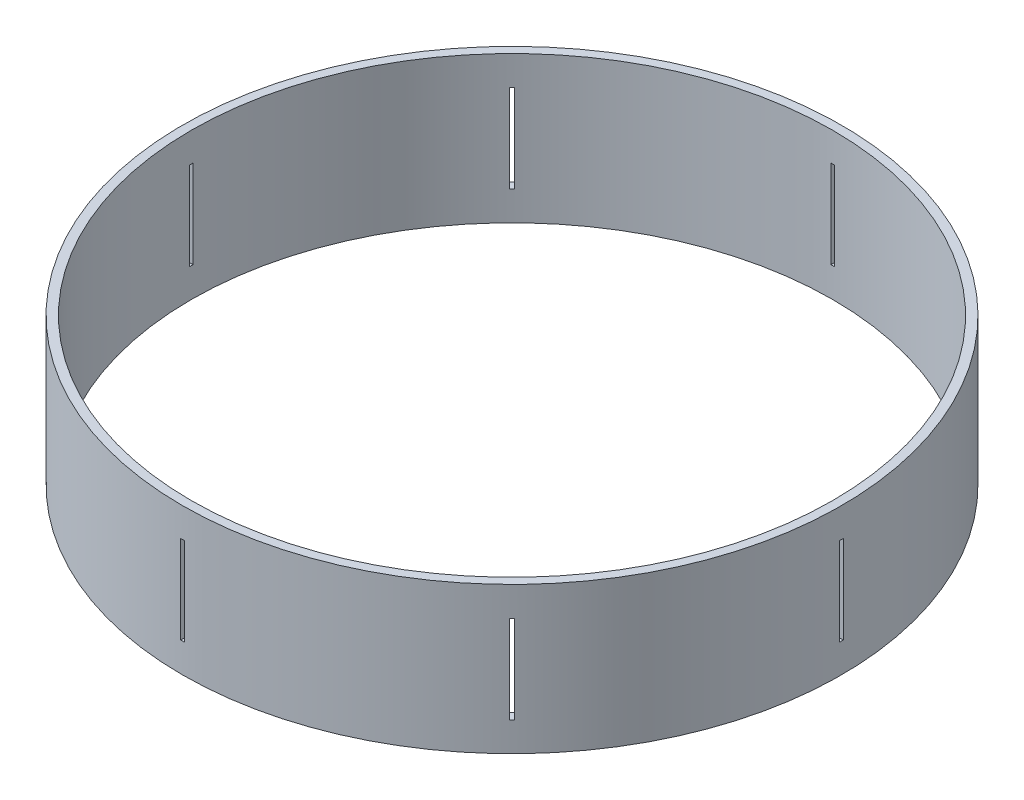
ISO-10303-21;
HEADER;
FILE_DESCRIPTION(('STEP AP214'),'2;1');
FILE_NAME('part.step','',(''),(''),'','','');
FILE_SCHEMA(('AUTOMOTIVE_DESIGN { 1 0 10303 214 1 1 1 1 }'));
ENDSEC;
DATA;
#1=APPLICATION_CONTEXT('core data for automotive mechanical design processes');
#2=APPLICATION_PROTOCOL_DEFINITION('international standard','automotive_design',2000,#1);
#3=PRODUCT_CONTEXT('',#1,'mechanical');
#4=PRODUCT('Part','Part','',(#3));
#5=PRODUCT_RELATED_PRODUCT_CATEGORY('part','',(#4));
#6=PRODUCT_DEFINITION_FORMATION('','',#4);
#7=PRODUCT_DEFINITION_CONTEXT('part definition',#1,'design');
#8=PRODUCT_DEFINITION('design','',#6,#7);
#9=PRODUCT_DEFINITION_SHAPE('','',#8);
#10=(LENGTH_UNIT() NAMED_UNIT(*) SI_UNIT(.MILLI.,.METRE.));
#11=(NAMED_UNIT(*) PLANE_ANGLE_UNIT() SI_UNIT($,.RADIAN.));
#12=(NAMED_UNIT(*) SI_UNIT($,.STERADIAN.) SOLID_ANGLE_UNIT());
#13=UNCERTAINTY_MEASURE_WITH_UNIT(LENGTH_MEASURE(1.E-05),#10,'distance_accuracy_value','');
#14=(GEOMETRIC_REPRESENTATION_CONTEXT(3) GLOBAL_UNCERTAINTY_ASSIGNED_CONTEXT((#13)) GLOBAL_UNIT_ASSIGNED_CONTEXT((#10,
#11,#12)) REPRESENTATION_CONTEXT('',''));
#15=CARTESIAN_POINT('',(0.,0.,0.));
#16=DIRECTION('',(0.,0.,1.));
#17=DIRECTION('',(1.,0.,0.));
#18=AXIS2_PLACEMENT_3D('',#15,#16,#17);
#19=CARTESIAN_POINT('',(138.90625,192.951652173913,0.));
#20=DIRECTION('',(0.,1.,0.));
#21=DIRECTION('',(0.,0.,1.));
#22=AXIS2_PLACEMENT_3D('',#19,#20,#21);
#23=PLANE('',#22);
#24=CARTESIAN_POINT('',(0.,192.951652173913,0.));
#25=DIRECTION('',(0.,1.,0.));
#26=DIRECTION('',(0.,0.,1.));
#27=AXIS2_PLACEMENT_3D('',#24,#25,#26);
#28=CIRCLE('',#27,142.71625);
#29=CARTESIAN_POINT('',(0.,192.951652173913,142.71625));
#30=VERTEX_POINT('',#29);
#31=EDGE_CURVE('E476',#30,#30,#28,.T.);
#32=ORIENTED_EDGE('',*,*,#31,.T.);
#33=EDGE_LOOP('',(#32));
#34=FACE_BOUND('',#33,.T.);
#35=CARTESIAN_POINT('',(0.,192.951652173913,0.));
#36=DIRECTION('',(0.,1.,0.));
#37=DIRECTION('',(0.,0.,1.));
#38=AXIS2_PLACEMENT_3D('',#35,#36,#37);
#39=CIRCLE('',#38,138.90625);
#40=CARTESIAN_POINT('',(0.,192.951652173913,138.90625));
#41=VERTEX_POINT('',#40);
#42=EDGE_CURVE('E464',#41,#41,#39,.T.);
#43=ORIENTED_EDGE('',*,*,#42,.F.);
#44=EDGE_LOOP('',(#43));
#45=FACE_BOUND('',#44,.T.);
#46=ADVANCED_FACE('F41',(#34,#45),#23,.T.);
#47=CARTESIAN_POINT('',(0.,0.,0.));
#48=DIRECTION('',(0.,1.,0.));
#49=DIRECTION('',(0.,0.,1.));
#50=AXIS2_PLACEMENT_3D('',#47,#48,#49);
#51=CYLINDRICAL_SURFACE('',#50,142.71625);
#52=DIRECTION('',(0.,1.,0.));
#53=VECTOR('',#52,1.);
#54=CARTESIAN_POINT('',(100.375374343753,0.,101.453005078282));
#55=LINE('',#54,#53);
#56=CARTESIAN_POINT('',(100.375374343753,180.251652173913,101.453005078282));
#57=VERTEX_POINT('',#56);
#58=CARTESIAN_POINT('',(100.375374343753,142.151652173913,101.453005078282));
#59=VERTEX_POINT('',#58);
#60=EDGE_CURVE('E375',#57,#59,#55,.F.);
#61=ORIENTED_EDGE('',*,*,#60,.F.);
#62=CARTESIAN_POINT('',(0.,180.251652173913,0.));
#63=DIRECTION('',(0.,-1.,0.));
#64=DIRECTION('',(0.,0.,-1.));
#65=AXIS2_PLACEMENT_3D('',#62,#63,#64);
#66=CIRCLE('',#65,142.71625);
#67=CARTESIAN_POINT('',(101.453005078282,180.251652173913,100.375374343754));
#68=VERTEX_POINT('',#67);
#69=EDGE_CURVE('E367',#68,#57,#66,.T.);
#70=ORIENTED_EDGE('',*,*,#69,.F.);
#71=DIRECTION('',(0.,1.,0.));
#72=VECTOR('',#71,1.);
#73=CARTESIAN_POINT('',(101.453005078282,0.,100.375374343754));
#74=LINE('',#73,#72);
#75=CARTESIAN_POINT('',(101.453005078282,142.151652173913,100.375374343754));
#76=VERTEX_POINT('',#75);
#77=EDGE_CURVE('E56',#76,#68,#74,.T.);
#78=ORIENTED_EDGE('',*,*,#77,.F.);
#79=CARTESIAN_POINT('',(0.,142.151652173913,0.));
#80=DIRECTION('',(0.,1.,0.));
#81=DIRECTION('',(0.,0.,1.));
#82=AXIS2_PLACEMENT_3D('',#79,#80,#81);
#83=CIRCLE('',#82,142.71625);
#84=EDGE_CURVE('E371',#59,#76,#83,.T.);
#85=ORIENTED_EDGE('',*,*,#84,.F.);
#86=EDGE_LOOP('',(#61,#70,#78,#85));
#87=FACE_BOUND('',#86,.T.);
#88=DIRECTION('',(0.,1.,0.));
#89=VECTOR('',#88,1.);
#90=CARTESIAN_POINT('',(-100.375374343753,0.,-101.453005078282));
#91=LINE('',#90,#89);
#92=CARTESIAN_POINT('',(-100.375374343753,142.151652173913,-101.453005078282));
#93=VERTEX_POINT('',#92);
#94=CARTESIAN_POINT('',(-100.375374343753,180.251652173913,-101.453005078282));
#95=VERTEX_POINT('',#94);
#96=EDGE_CURVE('E398',#93,#95,#91,.T.);
#97=ORIENTED_EDGE('',*,*,#96,.T.);
#98=CARTESIAN_POINT('',(0.,180.251652173913,0.));
#99=DIRECTION('',(0.,1.,0.));
#100=DIRECTION('',(0.,0.,1.));
#101=AXIS2_PLACEMENT_3D('',#98,#99,#100);
#102=CIRCLE('',#101,142.71625);
#103=CARTESIAN_POINT('',(-101.453005078282,180.251652173913,-100.375374343754));
#104=VERTEX_POINT('',#103);
#105=EDGE_CURVE('E392',#95,#104,#102,.T.);
#106=ORIENTED_EDGE('',*,*,#105,.T.);
#107=DIRECTION('',(0.,1.,0.));
#108=VECTOR('',#107,1.);
#109=CARTESIAN_POINT('',(-101.453005078282,0.,-100.375374343754));
#110=LINE('',#109,#108);
#111=CARTESIAN_POINT('',(-101.453005078282,142.151652173913,-100.375374343754));
#112=VERTEX_POINT('',#111);
#113=EDGE_CURVE('E386',#104,#112,#110,.F.);
#114=ORIENTED_EDGE('',*,*,#113,.T.);
#115=CARTESIAN_POINT('',(0.,142.151652173913,0.));
#116=DIRECTION('',(0.,-1.,0.));
#117=DIRECTION('',(0.,0.,-1.));
#118=AXIS2_PLACEMENT_3D('',#115,#116,#117);
#119=CIRCLE('',#118,142.71625);
#120=EDGE_CURVE('E370',#112,#93,#119,.T.);
#121=ORIENTED_EDGE('',*,*,#120,.T.);
#122=EDGE_LOOP('',(#97,#106,#114,#121));
#123=FACE_BOUND('',#122,.T.);
#124=DIRECTION('',(0.,1.,0.));
#125=VECTOR('',#124,1.);
#126=CARTESIAN_POINT('',(-100.375374343754,0.,101.453005078281));
#127=LINE('',#126,#125);
#128=CARTESIAN_POINT('',(-100.375374343754,142.151652173913,101.453005078281));
#129=VERTEX_POINT('',#128);
#130=CARTESIAN_POINT('',(-100.375374343754,180.251652173913,101.453005078281));
#131=VERTEX_POINT('',#130);
#132=EDGE_CURVE('E266',#129,#131,#127,.T.);
#133=ORIENTED_EDGE('',*,*,#132,.F.);
#134=CARTESIAN_POINT('',(0.,142.151652173913,0.));
#135=DIRECTION('',(0.,1.,0.));
#136=DIRECTION('',(0.,0.,1.));
#137=AXIS2_PLACEMENT_3D('',#134,#135,#136);
#138=CIRCLE('',#137,142.71625);
#139=CARTESIAN_POINT('',(-101.453005078282,142.151652173913,100.375374343753));
#140=VERTEX_POINT('',#139);
#141=EDGE_CURVE('E275',#140,#129,#138,.T.);
#142=ORIENTED_EDGE('',*,*,#141,.F.);
#143=DIRECTION('',(0.,1.,0.));
#144=VECTOR('',#143,1.);
#145=CARTESIAN_POINT('',(-101.453005078282,0.,100.375374343753));
#146=LINE('',#145,#144);
#147=CARTESIAN_POINT('',(-101.453005078282,180.251652173913,100.375374343753));
#148=VERTEX_POINT('',#147);
#149=EDGE_CURVE('E281',#148,#140,#146,.F.);
#150=ORIENTED_EDGE('',*,*,#149,.F.);
#151=CARTESIAN_POINT('',(0.,180.251652173913,0.));
#152=DIRECTION('',(0.,-1.,0.));
#153=DIRECTION('',(0.,0.,-1.));
#154=AXIS2_PLACEMENT_3D('',#151,#152,#153);
#155=CIRCLE('',#154,142.71625);
#156=EDGE_CURVE('E255',#131,#148,#155,.T.);
#157=ORIENTED_EDGE('',*,*,#156,.F.);
#158=EDGE_LOOP('',(#133,#142,#150,#157));
#159=FACE_BOUND('',#158,.T.);
#160=DIRECTION('',(0.,1.,0.));
#161=VECTOR('',#160,1.);
#162=CARTESIAN_POINT('',(-0.762000000000509,0.,142.714215725213));
#163=LINE('',#162,#161);
#164=CARTESIAN_POINT('',(-0.762000000000495,180.251652173913,142.714215725213));
#165=VERTEX_POINT('',#164);
#166=CARTESIAN_POINT('',(-0.762000000000498,142.151652173913,142.714215725213));
#167=VERTEX_POINT('',#166);
#168=EDGE_CURVE('E326',#165,#167,#163,.F.);
#169=ORIENTED_EDGE('',*,*,#168,.F.);
#170=CARTESIAN_POINT('',(0.,180.251652173913,0.));
#171=DIRECTION('',(0.,-1.,0.));
#172=DIRECTION('',(0.,0.,-1.));
#173=AXIS2_PLACEMENT_3D('',#170,#171,#172);
#174=CIRCLE('',#173,142.71625);
#175=CARTESIAN_POINT('',(0.761999999999499,180.251652173913,142.714215725213));
#176=VERTEX_POINT('',#175);
#177=EDGE_CURVE('E317',#176,#165,#174,.T.);
#178=ORIENTED_EDGE('',*,*,#177,.F.);
#179=DIRECTION('',(0.,1.,0.));
#180=VECTOR('',#179,1.);
#181=CARTESIAN_POINT('',(0.761999999999513,0.,142.714215725213));
#182=LINE('',#181,#180);
#183=CARTESIAN_POINT('',(0.761999999999513,142.151652173913,142.714215725213));
#184=VERTEX_POINT('',#183);
#185=EDGE_CURVE('E318',#184,#176,#182,.T.);
#186=ORIENTED_EDGE('',*,*,#185,.F.);
#187=CARTESIAN_POINT('',(0.,142.151652173913,0.));
#188=DIRECTION('',(0.,1.,0.));
#189=DIRECTION('',(0.,0.,1.));
#190=AXIS2_PLACEMENT_3D('',#187,#188,#189);
#191=CIRCLE('',#190,142.71625);
#192=EDGE_CURVE('E323',#167,#184,#191,.T.);
#193=ORIENTED_EDGE('',*,*,#192,.F.);
#194=EDGE_LOOP('',(#169,#178,#186,#193));
#195=FACE_BOUND('',#194,.T.);
#196=DIRECTION('',(0.,1.,0.));
#197=VECTOR('',#196,1.);
#198=CARTESIAN_POINT('',(0.762000000000509,0.,-142.714215725213));
#199=LINE('',#198,#197);
#200=CARTESIAN_POINT('',(0.762000000000498,142.151652173913,-142.714215725213));
#201=VERTEX_POINT('',#200);
#202=CARTESIAN_POINT('',(0.762000000000509,180.251652173913,-142.714215725213));
#203=VERTEX_POINT('',#202);
#204=EDGE_CURVE('E349',#201,#203,#199,.T.);
#205=ORIENTED_EDGE('',*,*,#204,.T.);
#206=CARTESIAN_POINT('',(0.,180.251652173913,0.));
#207=DIRECTION('',(0.,1.,0.));
#208=DIRECTION('',(0.,0.,1.));
#209=AXIS2_PLACEMENT_3D('',#206,#207,#208);
#210=CIRCLE('',#209,142.71625);
#211=CARTESIAN_POINT('',(-0.761999999999499,180.251652173913,-142.714215725213));
#212=VERTEX_POINT('',#211);
#213=EDGE_CURVE('E343',#203,#212,#210,.T.);
#214=ORIENTED_EDGE('',*,*,#213,.T.);
#215=DIRECTION('',(0.,1.,0.));
#216=VECTOR('',#215,1.);
#217=CARTESIAN_POINT('',(-0.761999999999513,0.,-142.714215725213));
#218=LINE('',#217,#216);
#219=CARTESIAN_POINT('',(-0.761999999999513,142.151652173913,-142.714215725213));
#220=VERTEX_POINT('',#219);
#221=EDGE_CURVE('E337',#212,#220,#218,.F.);
#222=ORIENTED_EDGE('',*,*,#221,.T.);
#223=CARTESIAN_POINT('',(0.,142.151652173913,0.));
#224=DIRECTION('',(0.,-1.,0.));
#225=DIRECTION('',(0.,0.,-1.));
#226=AXIS2_PLACEMENT_3D('',#223,#224,#225);
#227=CIRCLE('',#226,142.71625);
#228=EDGE_CURVE('E322',#220,#201,#227,.T.);
#229=ORIENTED_EDGE('',*,*,#228,.T.);
#230=EDGE_LOOP('',(#205,#214,#222,#229));
#231=FACE_BOUND('',#230,.T.);
#232=DIRECTION('',(0.,1.,0.));
#233=VECTOR('',#232,1.);
#234=CARTESIAN_POINT('',(101.453005078282,0.,-100.375374343753));
#235=LINE('',#234,#233);
#236=CARTESIAN_POINT('',(101.453005078282,142.151652173913,-100.375374343753));
#237=VERTEX_POINT('',#236);
#238=CARTESIAN_POINT('',(101.453005078282,180.251652173913,-100.375374343753));
#239=VERTEX_POINT('',#238);
#240=EDGE_CURVE('E263',#237,#239,#235,.T.);
#241=ORIENTED_EDGE('',*,*,#240,.T.);
#242=CARTESIAN_POINT('',(0.,180.251652173913,0.));
#243=DIRECTION('',(0.,1.,0.));
#244=DIRECTION('',(0.,0.,1.));
#245=AXIS2_PLACEMENT_3D('',#242,#243,#244);
#246=CIRCLE('',#245,142.71625);
#247=CARTESIAN_POINT('',(100.375374343754,180.251652173913,-101.453005078281));
#248=VERTEX_POINT('',#247);
#249=EDGE_CURVE('E297',#239,#248,#246,.T.);
#250=ORIENTED_EDGE('',*,*,#249,.T.);
#251=DIRECTION('',(0.,1.,0.));
#252=VECTOR('',#251,1.);
#253=CARTESIAN_POINT('',(100.375374343754,0.,-101.453005078281));
#254=LINE('',#253,#252);
#255=CARTESIAN_POINT('',(100.375374343754,142.151652173913,-101.453005078281));
#256=VERTEX_POINT('',#255);
#257=EDGE_CURVE('E291',#248,#256,#254,.F.);
#258=ORIENTED_EDGE('',*,*,#257,.T.);
#259=CARTESIAN_POINT('',(0.,142.151652173913,0.));
#260=DIRECTION('',(0.,-1.,0.));
#261=DIRECTION('',(0.,0.,-1.));
#262=AXIS2_PLACEMENT_3D('',#259,#260,#261);
#263=CIRCLE('',#262,142.71625);
#264=EDGE_CURVE('E274',#256,#237,#263,.T.);
#265=ORIENTED_EDGE('',*,*,#264,.T.);
#266=EDGE_LOOP('',(#241,#250,#258,#265));
#267=FACE_BOUND('',#266,.T.);
#268=CARTESIAN_POINT('',(0.,142.151652173913,0.));
#269=DIRECTION('',(0.,1.,0.));
#270=DIRECTION('',(0.,0.,1.));
#271=AXIS2_PLACEMENT_3D('',#268,#269,#270);
#272=CIRCLE('',#271,142.71625);
#273=CARTESIAN_POINT('',(142.714215725213,142.151652173913,0.762));
#274=VERTEX_POINT('',#273);
#275=CARTESIAN_POINT('',(142.714215725213,142.151652173913,-0.762));
#276=VERTEX_POINT('',#275);
#277=EDGE_CURVE('E420',#274,#276,#272,.T.);
#278=ORIENTED_EDGE('',*,*,#277,.F.);
#279=DIRECTION('',(0.,1.,0.));
#280=VECTOR('',#279,1.);
#281=CARTESIAN_POINT('',(142.714215725213,0.,0.762000000000011));
#282=LINE('',#281,#280);
#283=CARTESIAN_POINT('',(142.714215725213,180.251652173913,0.762000000000011));
#284=VERTEX_POINT('',#283);
#285=EDGE_CURVE('E424',#284,#274,#282,.F.);
#286=ORIENTED_EDGE('',*,*,#285,.F.);
#287=CARTESIAN_POINT('',(0.,180.251652173913,0.));
#288=DIRECTION('',(0.,-1.,0.));
#289=DIRECTION('',(0.,0.,-1.));
#290=AXIS2_PLACEMENT_3D('',#287,#288,#289);
#291=CIRCLE('',#290,142.71625);
#292=CARTESIAN_POINT('',(142.714215725213,180.251652173913,-0.761999999999997));
#293=VERTEX_POINT('',#292);
#294=EDGE_CURVE('E414',#293,#284,#291,.T.);
#295=ORIENTED_EDGE('',*,*,#294,.F.);
#296=DIRECTION('',(0.,1.,0.));
#297=VECTOR('',#296,1.);
#298=CARTESIAN_POINT('',(142.714215725213,0.,-0.762000000000011));
#299=LINE('',#298,#297);
#300=EDGE_CURVE('E415',#276,#293,#299,.T.);
#301=ORIENTED_EDGE('',*,*,#300,.F.);
#302=EDGE_LOOP('',(#278,#286,#295,#301));
#303=FACE_BOUND('',#302,.T.);
#304=CARTESIAN_POINT('',(0.,142.151652173913,0.));
#305=DIRECTION('',(0.,-1.,0.));
#306=DIRECTION('',(0.,0.,-1.));
#307=AXIS2_PLACEMENT_3D('',#304,#305,#306);
#308=CIRCLE('',#307,142.71625);
#309=CARTESIAN_POINT('',(-142.714215725213,142.151652173913,0.762000000000011));
#310=VERTEX_POINT('',#309);
#311=CARTESIAN_POINT('',(-142.714215725213,142.151652173913,-0.762));
#312=VERTEX_POINT('',#311);
#313=EDGE_CURVE('E419',#310,#312,#308,.T.);
#314=ORIENTED_EDGE('',*,*,#313,.T.);
#315=DIRECTION('',(0.,1.,0.));
#316=VECTOR('',#315,1.);
#317=CARTESIAN_POINT('',(-142.714215725213,0.,-0.762000000000011));
#318=LINE('',#317,#316);
#319=CARTESIAN_POINT('',(-142.714215725213,180.251652173913,-0.762000000000011));
#320=VERTEX_POINT('',#319);
#321=EDGE_CURVE('E446',#312,#320,#318,.T.);
#322=ORIENTED_EDGE('',*,*,#321,.T.);
#323=CARTESIAN_POINT('',(0.,180.251652173913,0.));
#324=DIRECTION('',(0.,1.,0.));
#325=DIRECTION('',(0.,0.,1.));
#326=AXIS2_PLACEMENT_3D('',#323,#324,#325);
#327=CIRCLE('',#326,142.71625);
#328=CARTESIAN_POINT('',(-142.714215725213,180.251652173913,0.761999999999997));
#329=VERTEX_POINT('',#328);
#330=EDGE_CURVE('E440',#320,#329,#327,.T.);
#331=ORIENTED_EDGE('',*,*,#330,.T.);
#332=DIRECTION('',(0.,1.,0.));
#333=VECTOR('',#332,1.);
#334=CARTESIAN_POINT('',(-142.714215725213,0.,0.762000000000011));
#335=LINE('',#334,#333);
#336=EDGE_CURVE('E434',#329,#310,#335,.F.);
#337=ORIENTED_EDGE('',*,*,#336,.T.);
#338=EDGE_LOOP('',(#314,#322,#331,#337));
#339=FACE_BOUND('',#338,.T.);
#340=CARTESIAN_POINT('',(0.,129.451652173913,0.));
#341=DIRECTION('',(0.,1.,0.));
#342=DIRECTION('',(0.,0.,1.));
#343=AXIS2_PLACEMENT_3D('',#340,#341,#342);
#344=CIRCLE('',#343,142.71625);
#345=CARTESIAN_POINT('',(0.,129.451652173913,142.71625));
#346=VERTEX_POINT('',#345);
#347=EDGE_CURVE('E472',#346,#346,#344,.T.);
#348=ORIENTED_EDGE('',*,*,#347,.T.);
#349=EDGE_LOOP('',(#348));
#350=FACE_BOUND('',#349,.T.);
#351=ORIENTED_EDGE('',*,*,#31,.F.);
#352=EDGE_LOOP('',(#351));
#353=FACE_BOUND('',#352,.T.);
#354=ADVANCED_FACE('F278',(#87,#123,#159,#195,#231,#267,#303,#339,#350,#353),#51,.T.);
#355=CARTESIAN_POINT('',(138.90625,129.451652173913,0.));
#356=DIRECTION('',(0.,1.,0.));
#357=DIRECTION('',(0.,0.,1.));
#358=AXIS2_PLACEMENT_3D('',#355,#356,#357);
#359=PLANE('',#358);
#360=ORIENTED_EDGE('',*,*,#347,.F.);
#361=EDGE_LOOP('',(#360));
#362=FACE_BOUND('',#361,.T.);
#363=CARTESIAN_POINT('',(0.,129.451652173913,0.));
#364=DIRECTION('',(0.,1.,0.));
#365=DIRECTION('',(0.,0.,1.));
#366=AXIS2_PLACEMENT_3D('',#363,#364,#365);
#367=CIRCLE('',#366,138.90625);
#368=CARTESIAN_POINT('',(0.,129.451652173913,138.90625));
#369=VERTEX_POINT('',#368);
#370=EDGE_CURVE('E468',#369,#369,#367,.T.);
#371=ORIENTED_EDGE('',*,*,#370,.T.);
#372=EDGE_LOOP('',(#371));
#373=FACE_BOUND('',#372,.T.);
#374=ADVANCED_FACE('F633',(#362,#373),#359,.F.);
#375=CARTESIAN_POINT('',(0.,0.,0.));
#376=DIRECTION('',(0.,1.,0.));
#377=DIRECTION('',(0.,0.,1.));
#378=AXIS2_PLACEMENT_3D('',#375,#376,#377);
#379=CYLINDRICAL_SURFACE('',#378,138.90625);
#380=CARTESIAN_POINT('',(0.,180.251652173913,0.));
#381=DIRECTION('',(0.,1.,0.));
#382=DIRECTION('',(0.,0.,1.));
#383=AXIS2_PLACEMENT_3D('',#380,#381,#382);
#384=CIRCLE('',#383,138.90625);
#385=CARTESIAN_POINT('',(98.7588887867603,180.251652173913,97.6812580522324));
#386=VERTEX_POINT('',#385);
#387=CARTESIAN_POINT('',(97.681258052232,180.251652173913,98.7588887867607));
#388=VERTEX_POINT('',#387);
#389=EDGE_CURVE('E515',#386,#388,#384,.F.);
#390=ORIENTED_EDGE('',*,*,#389,.T.);
#391=DIRECTION('',(0.,1.,0.));
#392=VECTOR('',#391,1.);
#393=CARTESIAN_POINT('',(97.681258052232,0.,98.7588887867607));
#394=LINE('',#393,#392);
#395=CARTESIAN_POINT('',(97.681258052232,142.151652173913,98.7588887867607));
#396=VERTEX_POINT('',#395);
#397=EDGE_CURVE('E11',#388,#396,#394,.F.);
#398=ORIENTED_EDGE('',*,*,#397,.T.);
#399=CARTESIAN_POINT('',(0.,142.151652173913,0.));
#400=DIRECTION('',(0.,-1.,0.));
#401=DIRECTION('',(0.,0.,-1.));
#402=AXIS2_PLACEMENT_3D('',#399,#400,#401);
#403=CIRCLE('',#402,138.90625);
#404=CARTESIAN_POINT('',(98.7588887867603,142.151652173913,97.6812580522324));
#405=VERTEX_POINT('',#404);
#406=EDGE_CURVE('E49',#396,#405,#403,.F.);
#407=ORIENTED_EDGE('',*,*,#406,.T.);
#408=DIRECTION('',(0.,1.,0.));
#409=VECTOR('',#408,1.);
#410=CARTESIAN_POINT('',(98.7588887867603,0.,97.6812580522323));
#411=LINE('',#410,#409);
#412=EDGE_CURVE('E560',#405,#386,#411,.T.);
#413=ORIENTED_EDGE('',*,*,#412,.T.);
#414=EDGE_LOOP('',(#390,#398,#407,#413));
#415=FACE_BOUND('',#414,.T.);
#416=CARTESIAN_POINT('',(-98.7588887867603,180.251652173913,-97.6812580522323));
#417=VERTEX_POINT('',#416);
#418=CARTESIAN_POINT('',(-97.681258052232,180.251652173913,-98.7588887867607));
#419=VERTEX_POINT('',#418);
#420=EDGE_CURVE('E555',#417,#419,#384,.F.);
#421=ORIENTED_EDGE('',*,*,#420,.T.);
#422=DIRECTION('',(0.,1.,0.));
#423=VECTOR('',#422,1.);
#424=CARTESIAN_POINT('',(-97.681258052232,0.,-98.7588887867607));
#425=LINE('',#424,#423);
#426=CARTESIAN_POINT('',(-97.681258052232,142.151652173913,-98.7588887867607));
#427=VERTEX_POINT('',#426);
#428=EDGE_CURVE('E556',#419,#427,#425,.F.);
#429=ORIENTED_EDGE('',*,*,#428,.T.);
#430=CARTESIAN_POINT('',(-98.7588887867603,142.151652173913,-97.6812580522324));
#431=VERTEX_POINT('',#430);
#432=EDGE_CURVE('E559',#427,#431,#403,.F.);
#433=ORIENTED_EDGE('',*,*,#432,.T.);
#434=DIRECTION('',(0.,1.,0.));
#435=VECTOR('',#434,1.);
#436=CARTESIAN_POINT('',(-98.7588887867603,0.,-97.6812580522323));
#437=LINE('',#436,#435);
#438=EDGE_CURVE('E550',#431,#417,#437,.T.);
#439=ORIENTED_EDGE('',*,*,#438,.T.);
#440=EDGE_LOOP('',(#421,#429,#433,#439));
#441=FACE_BOUND('',#440,.T.);
#442=CARTESIAN_POINT('',(-98.758888786761,142.151652173913,97.6812580522316));
#443=VERTEX_POINT('',#442);
#444=CARTESIAN_POINT('',(-97.6812580522327,142.151652173913,98.75888878676));
#445=VERTEX_POINT('',#444);
#446=EDGE_CURVE('E551',#443,#445,#403,.F.);
#447=ORIENTED_EDGE('',*,*,#446,.T.);
#448=DIRECTION('',(0.,1.,0.));
#449=VECTOR('',#448,1.);
#450=CARTESIAN_POINT('',(-97.6812580522327,0.,98.75888878676));
#451=LINE('',#450,#449);
#452=CARTESIAN_POINT('',(-97.6812580522327,180.251652173913,98.75888878676));
#453=VERTEX_POINT('',#452);
#454=EDGE_CURVE('E547',#445,#453,#451,.T.);
#455=ORIENTED_EDGE('',*,*,#454,.T.);
#456=CARTESIAN_POINT('',(-98.758888786761,180.251652173913,97.6812580522317));
#457=VERTEX_POINT('',#456);
#458=EDGE_CURVE('E258',#453,#457,#384,.F.);
#459=ORIENTED_EDGE('',*,*,#458,.T.);
#460=DIRECTION('',(0.,1.,0.));
#461=VECTOR('',#460,1.);
#462=CARTESIAN_POINT('',(-98.758888786761,0.,97.6812580522316));
#463=LINE('',#462,#461);
#464=EDGE_CURVE('E542',#457,#443,#463,.F.);
#465=ORIENTED_EDGE('',*,*,#464,.T.);
#466=EDGE_LOOP('',(#447,#455,#459,#465));
#467=FACE_BOUND('',#466,.T.);
#468=CARTESIAN_POINT('',(0.761999999999526,180.251652173913,138.904159927133));
#469=VERTEX_POINT('',#468);
#470=CARTESIAN_POINT('',(-0.762000000000482,180.251652173913,138.904159927133));
#471=VERTEX_POINT('',#470);
#472=EDGE_CURVE('E537',#469,#471,#384,.F.);
#473=ORIENTED_EDGE('',*,*,#472,.T.);
#474=DIRECTION('',(0.,1.,0.));
#475=VECTOR('',#474,1.);
#476=CARTESIAN_POINT('',(-0.762000000000496,0.,138.904159927133));
#477=LINE('',#476,#475);
#478=CARTESIAN_POINT('',(-0.762000000000485,142.151652173913,138.904159927133));
#479=VERTEX_POINT('',#478);
#480=EDGE_CURVE('E538',#471,#479,#477,.F.);
#481=ORIENTED_EDGE('',*,*,#480,.T.);
#482=CARTESIAN_POINT('',(0.761999999999515,142.151652173913,138.904159927133));
#483=VERTEX_POINT('',#482);
#484=EDGE_CURVE('E543',#479,#483,#403,.F.);
#485=ORIENTED_EDGE('',*,*,#484,.T.);
#486=DIRECTION('',(0.,1.,0.));
#487=VECTOR('',#486,1.);
#488=CARTESIAN_POINT('',(0.761999999999526,0.,138.904159927133));
#489=LINE('',#488,#487);
#490=EDGE_CURVE('E533',#483,#469,#489,.T.);
#491=ORIENTED_EDGE('',*,*,#490,.T.);
#492=EDGE_LOOP('',(#473,#481,#485,#491));
#493=FACE_BOUND('',#492,.T.);
#494=CARTESIAN_POINT('',(-0.761999999999526,180.251652173913,-138.904159927133));
#495=VERTEX_POINT('',#494);
#496=CARTESIAN_POINT('',(0.762000000000482,180.251652173913,-138.904159927133));
#497=VERTEX_POINT('',#496);
#498=EDGE_CURVE('E516',#495,#497,#384,.F.);
#499=ORIENTED_EDGE('',*,*,#498,.T.);
#500=DIRECTION('',(0.,1.,0.));
#501=VECTOR('',#500,1.);
#502=CARTESIAN_POINT('',(0.762000000000496,0.,-138.904159927133));
#503=LINE('',#502,#501);
#504=CARTESIAN_POINT('',(0.762000000000485,142.151652173913,-138.904159927133));
#505=VERTEX_POINT('',#504);
#506=EDGE_CURVE('E529',#497,#505,#503,.F.);
#507=ORIENTED_EDGE('',*,*,#506,.T.);
#508=CARTESIAN_POINT('',(-0.761999999999515,142.151652173913,-138.904159927133));
#509=VERTEX_POINT('',#508);
#510=EDGE_CURVE('E521',#505,#509,#403,.F.);
#511=ORIENTED_EDGE('',*,*,#510,.T.);
#512=DIRECTION('',(0.,1.,0.));
#513=VECTOR('',#512,1.);
#514=CARTESIAN_POINT('',(-0.761999999999526,0.,-138.904159927133));
#515=LINE('',#514,#513);
#516=EDGE_CURVE('E525',#509,#495,#515,.T.);
#517=ORIENTED_EDGE('',*,*,#516,.T.);
#518=EDGE_LOOP('',(#499,#507,#511,#517));
#519=FACE_BOUND('',#518,.T.);
#520=CARTESIAN_POINT('',(97.6812580522327,180.251652173913,-98.75888878676));
#521=VERTEX_POINT('',#520);
#522=CARTESIAN_POINT('',(98.758888786761,180.251652173913,-97.6812580522317));
#523=VERTEX_POINT('',#522);
#524=EDGE_CURVE('E510',#521,#523,#384,.F.);
#525=ORIENTED_EDGE('',*,*,#524,.T.);
#526=DIRECTION('',(0.,1.,0.));
#527=VECTOR('',#526,1.);
#528=CARTESIAN_POINT('',(98.758888786761,0.,-97.6812580522317));
#529=LINE('',#528,#527);
#530=CARTESIAN_POINT('',(98.758888786761,142.151652173913,-97.6812580522317));
#531=VERTEX_POINT('',#530);
#532=EDGE_CURVE('E520',#523,#531,#529,.F.);
#533=ORIENTED_EDGE('',*,*,#532,.T.);
#534=CARTESIAN_POINT('',(97.6812580522327,142.151652173913,-98.75888878676));
#535=VERTEX_POINT('',#534);
#536=EDGE_CURVE('E514',#531,#535,#403,.F.);
#537=ORIENTED_EDGE('',*,*,#536,.T.);
#538=DIRECTION('',(0.,1.,0.));
#539=VECTOR('',#538,1.);
#540=CARTESIAN_POINT('',(97.6812580522327,0.,-98.75888878676));
#541=LINE('',#540,#539);
#542=EDGE_CURVE('E506',#535,#521,#541,.T.);
#543=ORIENTED_EDGE('',*,*,#542,.T.);
#544=EDGE_LOOP('',(#525,#533,#537,#543));
#545=FACE_BOUND('',#544,.T.);
#546=DIRECTION('',(0.,1.,0.));
#547=VECTOR('',#546,1.);
#548=CARTESIAN_POINT('',(138.904159927133,0.,0.762000000000011));
#549=LINE('',#548,#547);
#550=CARTESIAN_POINT('',(138.904159927133,180.251652173913,0.761999999999997));
#551=VERTEX_POINT('',#550);
#552=CARTESIAN_POINT('',(138.904159927133,142.151652173913,0.762000000000011));
#553=VERTEX_POINT('',#552);
#554=EDGE_CURVE('E497',#551,#553,#549,.F.);
#555=ORIENTED_EDGE('',*,*,#554,.T.);
#556=CARTESIAN_POINT('',(0.,142.151652173913,0.));
#557=DIRECTION('',(0.,-1.,0.));
#558=DIRECTION('',(0.,0.,-1.));
#559=AXIS2_PLACEMENT_3D('',#556,#557,#558);
#560=CIRCLE('',#559,138.90625);
#561=CARTESIAN_POINT('',(138.904159927133,142.151652173913,-0.762));
#562=VERTEX_POINT('',#561);
#563=EDGE_CURVE('E498',#553,#562,#560,.F.);
#564=ORIENTED_EDGE('',*,*,#563,.T.);
#565=DIRECTION('',(0.,1.,0.));
#566=VECTOR('',#565,1.);
#567=CARTESIAN_POINT('',(138.904159927133,0.,-0.762000000000011));
#568=LINE('',#567,#566);
#569=CARTESIAN_POINT('',(138.904159927133,180.251652173913,-0.761999999999997));
#570=VERTEX_POINT('',#569);
#571=EDGE_CURVE('E502',#562,#570,#568,.T.);
#572=ORIENTED_EDGE('',*,*,#571,.T.);
#573=CARTESIAN_POINT('',(0.,180.251652173913,0.));
#574=DIRECTION('',(0.,1.,0.));
#575=DIRECTION('',(0.,0.,1.));
#576=AXIS2_PLACEMENT_3D('',#573,#574,#575);
#577=CIRCLE('',#576,138.90625);
#578=EDGE_CURVE('E489',#570,#551,#577,.F.);
#579=ORIENTED_EDGE('',*,*,#578,.T.);
#580=EDGE_LOOP('',(#555,#564,#572,#579));
#581=FACE_BOUND('',#580,.T.);
#582=DIRECTION('',(0.,1.,0.));
#583=VECTOR('',#582,1.);
#584=CARTESIAN_POINT('',(-138.904159927133,0.,-0.762000000000011));
#585=LINE('',#584,#583);
#586=CARTESIAN_POINT('',(-138.904159927133,180.251652173913,-0.761999999999997));
#587=VERTEX_POINT('',#586);
#588=CARTESIAN_POINT('',(-138.904159927133,142.151652173913,-0.762));
#589=VERTEX_POINT('',#588);
#590=EDGE_CURVE('E488',#587,#589,#585,.F.);
#591=ORIENTED_EDGE('',*,*,#590,.T.);
#592=CARTESIAN_POINT('',(-138.904159927133,142.151652173913,0.762));
#593=VERTEX_POINT('',#592);
#594=EDGE_CURVE('E493',#589,#593,#560,.F.);
#595=ORIENTED_EDGE('',*,*,#594,.T.);
#596=DIRECTION('',(0.,1.,0.));
#597=VECTOR('',#596,1.);
#598=CARTESIAN_POINT('',(-138.904159927133,0.,0.762000000000011));
#599=LINE('',#598,#597);
#600=CARTESIAN_POINT('',(-138.904159927133,180.251652173913,0.762000000000011));
#601=VERTEX_POINT('',#600);
#602=EDGE_CURVE('E480',#593,#601,#599,.T.);
#603=ORIENTED_EDGE('',*,*,#602,.T.);
#604=EDGE_CURVE('E484',#601,#587,#577,.F.);
#605=ORIENTED_EDGE('',*,*,#604,.T.);
#606=EDGE_LOOP('',(#591,#595,#603,#605));
#607=FACE_BOUND('',#606,.T.);
#608=ORIENTED_EDGE('',*,*,#370,.F.);
#609=EDGE_LOOP('',(#608));
#610=FACE_BOUND('',#609,.T.);
#611=ORIENTED_EDGE('',*,*,#42,.T.);
#612=EDGE_LOOP('',(#611));
#613=FACE_BOUND('',#612,.T.);
#614=ADVANCED_FACE('F590',(#415,#441,#467,#493,#519,#545,#581,#607,#610,#613),#379,.F.);
#615=CARTESIAN_POINT('',(-142.71725,180.251652173913,0.761999999999997));
#616=DIRECTION('',(0.,0.,1.));
#617=DIRECTION('',(0.,-1.,0.));
#618=AXIS2_PLACEMENT_3D('',#615,#616,#617);
#619=PLANE('',#618);
#620=DIRECTION('',(1.,0.,0.));
#621=VECTOR('',#620,1.);
#622=CARTESIAN_POINT('',(-142.71725,142.151652173913,0.762));
#623=LINE('',#622,#621);
#624=EDGE_CURVE('E460',#310,#593,#623,.T.);
#625=ORIENTED_EDGE('',*,*,#624,.F.);
#626=ORIENTED_EDGE('',*,*,#336,.F.);
#627=DIRECTION('',(1.,0.,0.));
#628=VECTOR('',#627,1.);
#629=CARTESIAN_POINT('',(-142.71725,180.251652173913,0.761999999999997));
#630=LINE('',#629,#628);
#631=EDGE_CURVE('E439',#329,#601,#630,.T.);
#632=ORIENTED_EDGE('',*,*,#631,.T.);
#633=ORIENTED_EDGE('',*,*,#602,.F.);
#634=EDGE_LOOP('',(#625,#626,#632,#633));
#635=FACE_BOUND('',#634,.T.);
#636=ADVANCED_FACE('F640',(#635),#619,.F.);
#637=CARTESIAN_POINT('',(-142.71725,180.251652173913,0.761999999999997));
#638=DIRECTION('',(0.,1.,0.));
#639=DIRECTION('',(0.,0.,1.));
#640=AXIS2_PLACEMENT_3D('',#637,#638,#639);
#641=PLANE('',#640);
#642=ORIENTED_EDGE('',*,*,#631,.F.);
#643=ORIENTED_EDGE('',*,*,#330,.F.);
#644=DIRECTION('',(1.,0.,0.));
#645=VECTOR('',#644,1.);
#646=CARTESIAN_POINT('',(-142.71725,180.251652173913,-0.761999999999997));
#647=LINE('',#646,#645);
#648=EDGE_CURVE('E445',#320,#587,#647,.T.);
#649=ORIENTED_EDGE('',*,*,#648,.T.);
#650=ORIENTED_EDGE('',*,*,#604,.F.);
#651=EDGE_LOOP('',(#642,#643,#649,#650));
#652=FACE_BOUND('',#651,.T.);
#653=ADVANCED_FACE('F646',(#652),#641,.F.);
#654=CARTESIAN_POINT('',(-142.71725,180.251652173913,-0.761999999999997));
#655=DIRECTION('',(0.,0.,-1.));
#656=DIRECTION('',(0.,1.,0.));
#657=AXIS2_PLACEMENT_3D('',#654,#655,#656);
#658=PLANE('',#657);
#659=ORIENTED_EDGE('',*,*,#648,.F.);
#660=ORIENTED_EDGE('',*,*,#321,.F.);
#661=DIRECTION('',(1.,0.,0.));
#662=VECTOR('',#661,1.);
#663=CARTESIAN_POINT('',(-142.71725,142.151652173913,-0.762));
#664=LINE('',#663,#662);
#665=EDGE_CURVE('E451',#312,#589,#664,.T.);
#666=ORIENTED_EDGE('',*,*,#665,.T.);
#667=ORIENTED_EDGE('',*,*,#590,.F.);
#668=EDGE_LOOP('',(#659,#660,#666,#667));
#669=FACE_BOUND('',#668,.T.);
#670=ADVANCED_FACE('F657',(#669),#658,.F.);
#671=CARTESIAN_POINT('',(-142.71725,142.151652173913,0.762));
#672=DIRECTION('',(0.,-1.,0.));
#673=DIRECTION('',(0.,0.,-1.));
#674=AXIS2_PLACEMENT_3D('',#671,#672,#673);
#675=PLANE('',#674);
#676=ORIENTED_EDGE('',*,*,#665,.F.);
#677=ORIENTED_EDGE('',*,*,#313,.F.);
#678=ORIENTED_EDGE('',*,*,#624,.T.);
#679=ORIENTED_EDGE('',*,*,#594,.F.);
#680=EDGE_LOOP('',(#676,#677,#678,#679));
#681=FACE_BOUND('',#680,.T.);
#682=ADVANCED_FACE('F653',(#681),#675,.F.);
#683=EDGE_CURVE('E438',#553,#274,#623,.T.);
#684=ORIENTED_EDGE('',*,*,#683,.T.);
#685=ORIENTED_EDGE('',*,*,#277,.T.);
#686=EDGE_CURVE('E433',#562,#276,#664,.T.);
#687=ORIENTED_EDGE('',*,*,#686,.F.);
#688=ORIENTED_EDGE('',*,*,#563,.F.);
#689=EDGE_LOOP('',(#684,#685,#687,#688));
#690=FACE_BOUND('',#689,.T.);
#691=ADVANCED_FACE('F656',(#690),#675,.F.);
#692=ORIENTED_EDGE('',*,*,#686,.T.);
#693=ORIENTED_EDGE('',*,*,#300,.T.);
#694=EDGE_CURVE('E450',#570,#293,#647,.T.);
#695=ORIENTED_EDGE('',*,*,#694,.F.);
#696=ORIENTED_EDGE('',*,*,#571,.F.);
#697=EDGE_LOOP('',(#692,#693,#695,#696));
#698=FACE_BOUND('',#697,.T.);
#699=ADVANCED_FACE('F662',(#698),#658,.F.);
#700=ORIENTED_EDGE('',*,*,#694,.T.);
#701=ORIENTED_EDGE('',*,*,#294,.T.);
#702=EDGE_CURVE('E444',#551,#284,#630,.T.);
#703=ORIENTED_EDGE('',*,*,#702,.F.);
#704=ORIENTED_EDGE('',*,*,#578,.F.);
#705=EDGE_LOOP('',(#700,#701,#703,#704));
#706=FACE_BOUND('',#705,.T.);
#707=ADVANCED_FACE('F665',(#706),#641,.F.);
#708=ORIENTED_EDGE('',*,*,#702,.T.);
#709=ORIENTED_EDGE('',*,*,#285,.T.);
#710=ORIENTED_EDGE('',*,*,#683,.F.);
#711=ORIENTED_EDGE('',*,*,#554,.F.);
#712=EDGE_LOOP('',(#708,#709,#710,#711));
#713=FACE_BOUND('',#712,.T.);
#714=ADVANCED_FACE('F649',(#713),#619,.F.);
#715=CARTESIAN_POINT('',(143.256065367265,180.251652173913,-142.178434632735));
#716=DIRECTION('',(0.707106781186544,0.,0.707106781186551));
#717=DIRECTION('',(0.707106781186551,0.,-0.707106781186544));
#718=AXIS2_PLACEMENT_3D('',#715,#716,#717);
#719=PLANE('',#718);
#720=DIRECTION('',(-0.707106781186551,0.,0.707106781186544));
#721=VECTOR('',#720,1.);
#722=CARTESIAN_POINT('',(143.256065367265,180.251652173913,-142.178434632735));
#723=LINE('',#722,#721);
#724=EDGE_CURVE('E262',#239,#523,#723,.T.);
#725=ORIENTED_EDGE('',*,*,#724,.F.);
#726=ORIENTED_EDGE('',*,*,#240,.F.);
#727=DIRECTION('',(-0.707106781186551,0.,0.707106781186544));
#728=VECTOR('',#727,1.);
#729=CARTESIAN_POINT('',(143.256065367265,142.151652173913,-142.178434632735));
#730=LINE('',#729,#728);
#731=EDGE_CURVE('E305',#237,#531,#730,.T.);
#732=ORIENTED_EDGE('',*,*,#731,.T.);
#733=ORIENTED_EDGE('',*,*,#532,.F.);
#734=EDGE_LOOP('',(#725,#726,#732,#733));
#735=FACE_BOUND('',#734,.T.);
#736=ADVANCED_FACE('F667',(#735),#719,.F.);
#737=CARTESIAN_POINT('',(142.178434632737,180.251652173913,-143.256065367263));
#738=DIRECTION('',(-0.707106781186544,0.,-0.707106781186551));
#739=DIRECTION('',(-0.707106781186551,0.,0.707106781186544));
#740=AXIS2_PLACEMENT_3D('',#737,#738,#739);
#741=PLANE('',#740);
#742=DIRECTION('',(-0.707106781186551,0.,0.707106781186544));
#743=VECTOR('',#742,1.);
#744=CARTESIAN_POINT('',(142.178434632737,142.151652173913,-143.256065367263));
#745=LINE('',#744,#743);
#746=EDGE_CURVE('E313',#256,#535,#745,.T.);
#747=ORIENTED_EDGE('',*,*,#746,.F.);
#748=ORIENTED_EDGE('',*,*,#257,.F.);
#749=DIRECTION('',(-0.707106781186551,0.,0.707106781186544));
#750=VECTOR('',#749,1.);
#751=CARTESIAN_POINT('',(142.178434632737,180.251652173913,-143.256065367263));
#752=LINE('',#751,#750);
#753=EDGE_CURVE('E296',#248,#521,#752,.T.);
#754=ORIENTED_EDGE('',*,*,#753,.T.);
#755=ORIENTED_EDGE('',*,*,#542,.F.);
#756=EDGE_LOOP('',(#747,#748,#754,#755));
#757=FACE_BOUND('',#756,.T.);
#758=ADVANCED_FACE('F622',(#757),#741,.F.);
#759=CARTESIAN_POINT('',(-143.256065367264,180.251652173913,-142.178434632736));
#760=DIRECTION('',(0.,1.,0.));
#761=DIRECTION('',(0.,0.,1.));
#762=AXIS2_PLACEMENT_3D('',#759,#760,#761);
#763=PLANE('',#762);
#764=ORIENTED_EDGE('',*,*,#753,.F.);
#765=ORIENTED_EDGE('',*,*,#249,.F.);
#766=ORIENTED_EDGE('',*,*,#724,.T.);
#767=ORIENTED_EDGE('',*,*,#524,.F.);
#768=EDGE_LOOP('',(#764,#765,#766,#767));
#769=FACE_BOUND('',#768,.T.);
#770=ADVANCED_FACE('F608',(#769),#763,.F.);
#771=CARTESIAN_POINT('',(-143.256065367264,142.151652173913,-142.178434632736));
#772=DIRECTION('',(0.,-1.,0.));
#773=DIRECTION('',(0.,0.,-1.));
#774=AXIS2_PLACEMENT_3D('',#771,#772,#773);
#775=PLANE('',#774);
#776=ORIENTED_EDGE('',*,*,#731,.F.);
#777=ORIENTED_EDGE('',*,*,#264,.F.);
#778=ORIENTED_EDGE('',*,*,#746,.T.);
#779=ORIENTED_EDGE('',*,*,#536,.F.);
#780=EDGE_LOOP('',(#776,#777,#778,#779));
#781=FACE_BOUND('',#780,.T.);
#782=ADVANCED_FACE('F617',(#781),#775,.F.);
#783=CARTESIAN_POINT('',(0.762000000000495,180.251652173913,-142.71725));
#784=DIRECTION('',(1.,0.,0.));
#785=DIRECTION('',(0.,0.,-1.));
#786=AXIS2_PLACEMENT_3D('',#783,#784,#785);
#787=PLANE('',#786);
#788=DIRECTION('',(0.,0.,1.));
#789=VECTOR('',#788,1.);
#790=CARTESIAN_POINT('',(0.762000000000495,180.251652173913,-142.71725));
#791=LINE('',#790,#789);
#792=EDGE_CURVE('E348',#203,#497,#791,.T.);
#793=ORIENTED_EDGE('',*,*,#792,.F.);
#794=ORIENTED_EDGE('',*,*,#204,.F.);
#795=DIRECTION('',(0.,0.,1.));
#796=VECTOR('',#795,1.);
#797=CARTESIAN_POINT('',(0.762000000000498,142.151652173913,-142.71725));
#798=LINE('',#797,#796);
#799=EDGE_CURVE('E354',#201,#505,#798,.T.);
#800=ORIENTED_EDGE('',*,*,#799,.T.);
#801=ORIENTED_EDGE('',*,*,#506,.F.);
#802=EDGE_LOOP('',(#793,#794,#800,#801));
#803=FACE_BOUND('',#802,.T.);
#804=ADVANCED_FACE('F598',(#803),#787,.F.);
#805=CARTESIAN_POINT('',(-0.761999999999499,180.251652173913,-142.71725));
#806=DIRECTION('',(-1.,0.,0.));
#807=DIRECTION('',(0.,0.,1.));
#808=AXIS2_PLACEMENT_3D('',#805,#806,#807);
#809=PLANE('',#808);
#810=DIRECTION('',(0.,0.,1.));
#811=VECTOR('',#810,1.);
#812=CARTESIAN_POINT('',(-0.761999999999502,142.151652173913,-142.71725));
#813=LINE('',#812,#811);
#814=EDGE_CURVE('E363',#220,#509,#813,.T.);
#815=ORIENTED_EDGE('',*,*,#814,.F.);
#816=ORIENTED_EDGE('',*,*,#221,.F.);
#817=DIRECTION('',(0.,0.,1.));
#818=VECTOR('',#817,1.);
#819=CARTESIAN_POINT('',(-0.761999999999499,180.251652173913,-142.71725));
#820=LINE('',#819,#818);
#821=EDGE_CURVE('E342',#212,#495,#820,.T.);
#822=ORIENTED_EDGE('',*,*,#821,.T.);
#823=ORIENTED_EDGE('',*,*,#516,.F.);
#824=EDGE_LOOP('',(#815,#816,#822,#823));
#825=FACE_BOUND('',#824,.T.);
#826=ADVANCED_FACE('F603',(#825),#809,.F.);
#827=ORIENTED_EDGE('',*,*,#821,.F.);
#828=ORIENTED_EDGE('',*,*,#213,.F.);
#829=ORIENTED_EDGE('',*,*,#792,.T.);
#830=ORIENTED_EDGE('',*,*,#498,.F.);
#831=EDGE_LOOP('',(#827,#828,#829,#830));
#832=FACE_BOUND('',#831,.T.);
#833=ADVANCED_FACE('F605',(#832),#763,.F.);
#834=ORIENTED_EDGE('',*,*,#799,.F.);
#835=ORIENTED_EDGE('',*,*,#228,.F.);
#836=ORIENTED_EDGE('',*,*,#814,.T.);
#837=ORIENTED_EDGE('',*,*,#510,.F.);
#838=EDGE_LOOP('',(#834,#835,#836,#837));
#839=FACE_BOUND('',#838,.T.);
#840=ADVANCED_FACE('F594',(#839),#775,.F.);
#841=EDGE_CURVE('E347',#471,#165,#820,.T.);
#842=ORIENTED_EDGE('',*,*,#841,.T.);
#843=ORIENTED_EDGE('',*,*,#168,.T.);
#844=EDGE_CURVE('E341',#479,#167,#813,.T.);
#845=ORIENTED_EDGE('',*,*,#844,.F.);
#846=ORIENTED_EDGE('',*,*,#480,.F.);
#847=EDGE_LOOP('',(#842,#843,#845,#846));
#848=FACE_BOUND('',#847,.T.);
#849=ADVANCED_FACE('F614',(#848),#809,.F.);
#850=EDGE_CURVE('E336',#483,#184,#798,.T.);
#851=ORIENTED_EDGE('',*,*,#850,.T.);
#852=ORIENTED_EDGE('',*,*,#185,.T.);
#853=EDGE_CURVE('E353',#469,#176,#791,.T.);
#854=ORIENTED_EDGE('',*,*,#853,.F.);
#855=ORIENTED_EDGE('',*,*,#490,.F.);
#856=EDGE_LOOP('',(#851,#852,#854,#855));
#857=FACE_BOUND('',#856,.T.);
#858=ADVANCED_FACE('F822',(#857),#787,.F.);
#859=ORIENTED_EDGE('',*,*,#853,.T.);
#860=ORIENTED_EDGE('',*,*,#177,.T.);
#861=ORIENTED_EDGE('',*,*,#841,.F.);
#862=ORIENTED_EDGE('',*,*,#472,.F.);
#863=EDGE_LOOP('',(#859,#860,#861,#862));
#864=FACE_BOUND('',#863,.T.);
#865=ADVANCED_FACE('F689',(#864),#763,.F.);
#866=ORIENTED_EDGE('',*,*,#844,.T.);
#867=ORIENTED_EDGE('',*,*,#192,.T.);
#868=ORIENTED_EDGE('',*,*,#850,.F.);
#869=ORIENTED_EDGE('',*,*,#484,.F.);
#870=EDGE_LOOP('',(#866,#867,#868,#869));
#871=FACE_BOUND('',#870,.T.);
#872=ADVANCED_FACE('F691',(#871),#775,.F.);
#873=EDGE_CURVE('E301',#457,#148,#752,.T.);
#874=ORIENTED_EDGE('',*,*,#873,.T.);
#875=ORIENTED_EDGE('',*,*,#149,.T.);
#876=EDGE_CURVE('E295',#443,#140,#745,.T.);
#877=ORIENTED_EDGE('',*,*,#876,.F.);
#878=ORIENTED_EDGE('',*,*,#464,.F.);
#879=EDGE_LOOP('',(#874,#875,#877,#878));
#880=FACE_BOUND('',#879,.T.);
#881=ADVANCED_FACE('F713',(#880),#741,.F.);
#882=EDGE_CURVE('E269',#445,#129,#730,.T.);
#883=ORIENTED_EDGE('',*,*,#882,.T.);
#884=ORIENTED_EDGE('',*,*,#132,.T.);
#885=EDGE_CURVE('E250',#453,#131,#723,.T.);
#886=ORIENTED_EDGE('',*,*,#885,.F.);
#887=ORIENTED_EDGE('',*,*,#454,.F.);
#888=EDGE_LOOP('',(#883,#884,#886,#887));
#889=FACE_BOUND('',#888,.T.);
#890=ADVANCED_FACE('F267',(#889),#719,.F.);
#891=ORIENTED_EDGE('',*,*,#885,.T.);
#892=ORIENTED_EDGE('',*,*,#156,.T.);
#893=ORIENTED_EDGE('',*,*,#873,.F.);
#894=ORIENTED_EDGE('',*,*,#458,.F.);
#895=EDGE_LOOP('',(#891,#892,#893,#894));
#896=FACE_BOUND('',#895,.T.);
#897=ADVANCED_FACE('F252',(#896),#763,.F.);
#898=ORIENTED_EDGE('',*,*,#876,.T.);
#899=ORIENTED_EDGE('',*,*,#141,.T.);
#900=ORIENTED_EDGE('',*,*,#882,.F.);
#901=ORIENTED_EDGE('',*,*,#446,.F.);
#902=EDGE_LOOP('',(#898,#899,#900,#901));
#903=FACE_BOUND('',#902,.T.);
#904=ADVANCED_FACE('F672',(#903),#775,.F.);
#905=CARTESIAN_POINT('',(-143.256065367264,180.251652173913,-142.178434632736));
#906=DIRECTION('',(-0.707106781186549,0.,0.707106781186546));
#907=DIRECTION('',(0.707106781186546,0.,0.707106781186549));
#908=AXIS2_PLACEMENT_3D('',#905,#906,#907);
#909=PLANE('',#908);
#910=DIRECTION('',(0.707106781186546,0.,0.707106781186549));
#911=VECTOR('',#910,1.);
#912=CARTESIAN_POINT('',(-143.256065367264,142.151652173913,-142.178434632736));
#913=LINE('',#912,#911);
#914=EDGE_CURVE('E64',#112,#431,#913,.T.);
#915=ORIENTED_EDGE('',*,*,#914,.F.);
#916=ORIENTED_EDGE('',*,*,#113,.F.);
#917=DIRECTION('',(0.707106781186546,0.,0.707106781186549));
#918=VECTOR('',#917,1.);
#919=CARTESIAN_POINT('',(-143.256065367264,180.251652173913,-142.178434632736));
#920=LINE('',#919,#918);
#921=EDGE_CURVE('E391',#104,#417,#920,.T.);
#922=ORIENTED_EDGE('',*,*,#921,.T.);
#923=ORIENTED_EDGE('',*,*,#438,.F.);
#924=EDGE_LOOP('',(#915,#916,#922,#923));
#925=FACE_BOUND('',#924,.T.);
#926=ADVANCED_FACE('F626',(#925),#909,.F.);
#927=ORIENTED_EDGE('',*,*,#921,.F.);
#928=ORIENTED_EDGE('',*,*,#105,.F.);
#929=DIRECTION('',(0.707106781186546,0.,0.707106781186549));
#930=VECTOR('',#929,1.);
#931=CARTESIAN_POINT('',(-142.178434632736,180.251652173913,-143.256065367264));
#932=LINE('',#931,#930);
#933=EDGE_CURVE('E397',#95,#419,#932,.T.);
#934=ORIENTED_EDGE('',*,*,#933,.T.);
#935=ORIENTED_EDGE('',*,*,#420,.F.);
#936=EDGE_LOOP('',(#927,#928,#934,#935));
#937=FACE_BOUND('',#936,.T.);
#938=ADVANCED_FACE('F609',(#937),#763,.F.);
#939=DIRECTION('',(0.707106781186546,0.,0.707106781186549));
#940=VECTOR('',#939,1.);
#941=CARTESIAN_POINT('',(-142.178434632736,142.151652173913,-143.256065367264));
#942=LINE('',#941,#940);
#943=EDGE_CURVE('E403',#93,#427,#942,.T.);
#944=ORIENTED_EDGE('',*,*,#943,.F.);
#945=ORIENTED_EDGE('',*,*,#120,.F.);
#946=ORIENTED_EDGE('',*,*,#914,.T.);
#947=ORIENTED_EDGE('',*,*,#432,.F.);
#948=EDGE_LOOP('',(#944,#945,#946,#947));
#949=FACE_BOUND('',#948,.T.);
#950=ADVANCED_FACE('F616',(#949),#775,.F.);
#951=CARTESIAN_POINT('',(-142.178434632736,180.251652173913,-143.256065367264));
#952=DIRECTION('',(0.707106781186549,0.,-0.707106781186546));
#953=DIRECTION('',(-0.707106781186546,0.,-0.707106781186549));
#954=AXIS2_PLACEMENT_3D('',#951,#952,#953);
#955=PLANE('',#954);
#956=ORIENTED_EDGE('',*,*,#933,.F.);
#957=ORIENTED_EDGE('',*,*,#96,.F.);
#958=ORIENTED_EDGE('',*,*,#943,.T.);
#959=ORIENTED_EDGE('',*,*,#428,.F.);
#960=EDGE_LOOP('',(#956,#957,#958,#959));
#961=FACE_BOUND('',#960,.T.);
#962=ADVANCED_FACE('F670',(#961),#955,.F.);
#963=EDGE_CURVE('E396',#388,#57,#920,.T.);
#964=ORIENTED_EDGE('',*,*,#963,.T.);
#965=ORIENTED_EDGE('',*,*,#60,.T.);
#966=EDGE_CURVE('E390',#396,#59,#913,.T.);
#967=ORIENTED_EDGE('',*,*,#966,.F.);
#968=ORIENTED_EDGE('',*,*,#397,.F.);
#969=EDGE_LOOP('',(#964,#965,#967,#968));
#970=FACE_BOUND('',#969,.T.);
#971=ADVANCED_FACE('F674',(#970),#909,.F.);
#972=ORIENTED_EDGE('',*,*,#966,.T.);
#973=ORIENTED_EDGE('',*,*,#84,.T.);
#974=EDGE_CURVE('E385',#405,#76,#942,.T.);
#975=ORIENTED_EDGE('',*,*,#974,.F.);
#976=ORIENTED_EDGE('',*,*,#406,.F.);
#977=EDGE_LOOP('',(#972,#973,#975,#976));
#978=FACE_BOUND('',#977,.T.);
#979=ADVANCED_FACE('F680',(#978),#775,.F.);
#980=ORIENTED_EDGE('',*,*,#974,.T.);
#981=ORIENTED_EDGE('',*,*,#77,.T.);
#982=EDGE_CURVE('E402',#386,#68,#932,.T.);
#983=ORIENTED_EDGE('',*,*,#982,.F.);
#984=ORIENTED_EDGE('',*,*,#412,.F.);
#985=EDGE_LOOP('',(#980,#981,#983,#984));
#986=FACE_BOUND('',#985,.T.);
#987=ADVANCED_FACE('F676',(#986),#955,.F.);
#988=ORIENTED_EDGE('',*,*,#982,.T.);
#989=ORIENTED_EDGE('',*,*,#69,.T.);
#990=ORIENTED_EDGE('',*,*,#963,.F.);
#991=ORIENTED_EDGE('',*,*,#389,.F.);
#992=EDGE_LOOP('',(#988,#989,#990,#991));
#993=FACE_BOUND('',#992,.T.);
#994=ADVANCED_FACE('F624',(#993),#763,.F.);
#995=CLOSED_SHELL('',(#46,#354,#374,#614,#636,#653,#670,#682,#691,#699,#707,#714,#736,#758,#770,
#782,#804,#826,#833,#840,#849,#858,#865,#872,#881,#890,#897,#904,#926,#938,#950,#962,#971,#979,
#987,#994));
#996=MANIFOLD_SOLID_BREP('B2',#995);
#997=ADVANCED_BREP_SHAPE_REPRESENTATION('',(#18,#996),#14);
#998=SHAPE_DEFINITION_REPRESENTATION(#9,#997);
ENDSEC;
END-ISO-10303-21;
